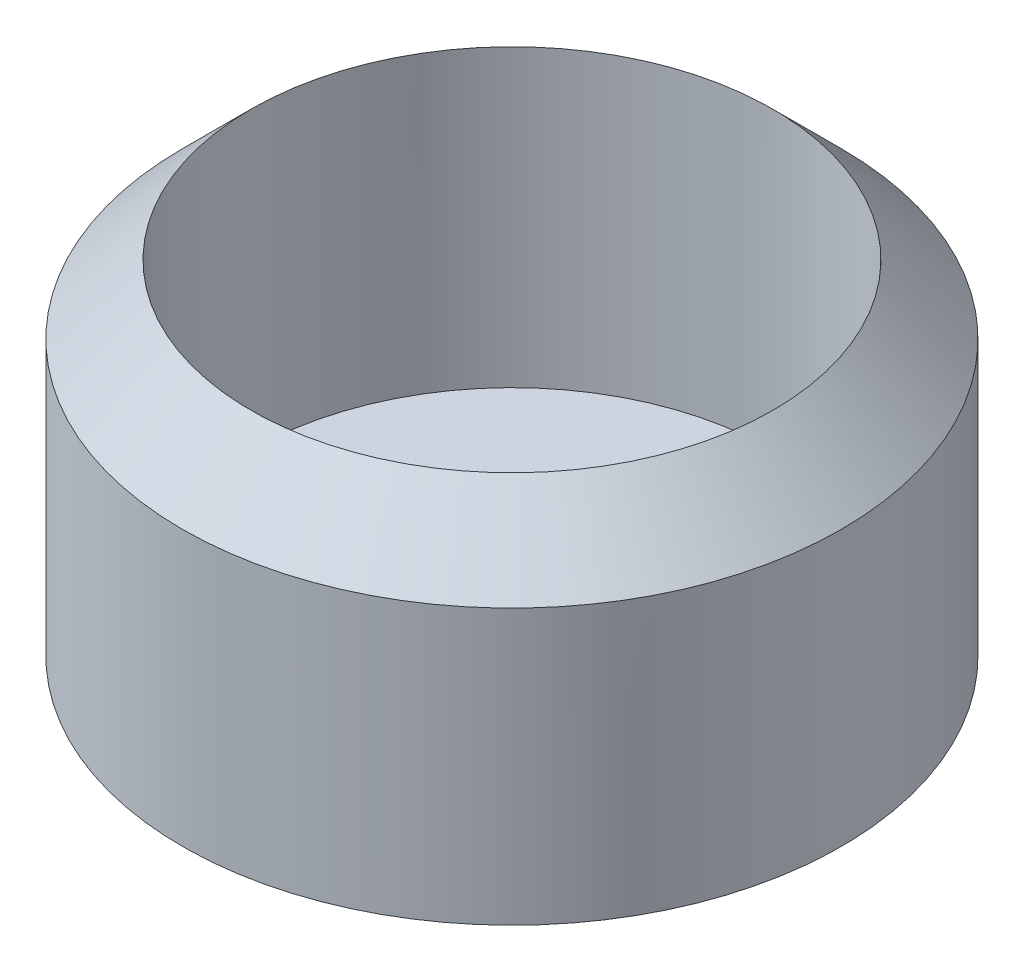
ISO-10303-21;
HEADER;
FILE_DESCRIPTION(('STEP AP214'),'2;1');
FILE_NAME('part.step','',(''),(''),'','','');
FILE_SCHEMA(('AUTOMOTIVE_DESIGN { 1 0 10303 214 1 1 1 1 }'));
ENDSEC;
DATA;
#1=APPLICATION_CONTEXT('core data for automotive mechanical design processes');
#2=APPLICATION_PROTOCOL_DEFINITION('international standard','automotive_design',2000,#1);
#3=PRODUCT_CONTEXT('',#1,'mechanical');
#4=PRODUCT('Part','Part','',(#3));
#5=PRODUCT_RELATED_PRODUCT_CATEGORY('part','',(#4));
#6=PRODUCT_DEFINITION_FORMATION('','',#4);
#7=PRODUCT_DEFINITION_CONTEXT('part definition',#1,'design');
#8=PRODUCT_DEFINITION('design','',#6,#7);
#9=PRODUCT_DEFINITION_SHAPE('','',#8);
#10=(LENGTH_UNIT() NAMED_UNIT(*) SI_UNIT(.MILLI.,.METRE.));
#11=(NAMED_UNIT(*) PLANE_ANGLE_UNIT() SI_UNIT($,.RADIAN.));
#12=(NAMED_UNIT(*) SI_UNIT($,.STERADIAN.) SOLID_ANGLE_UNIT());
#13=UNCERTAINTY_MEASURE_WITH_UNIT(LENGTH_MEASURE(1.E-05),#10,'distance_accuracy_value','');
#14=(GEOMETRIC_REPRESENTATION_CONTEXT(3) GLOBAL_UNCERTAINTY_ASSIGNED_CONTEXT((#13)) GLOBAL_UNIT_ASSIGNED_CONTEXT((#10,
#11,#12)) REPRESENTATION_CONTEXT('',''));
#15=CARTESIAN_POINT('',(0.,0.,0.));
#16=DIRECTION('',(0.,0.,1.));
#17=DIRECTION('',(1.,0.,0.));
#18=AXIS2_PLACEMENT_3D('',#15,#16,#17);
#19=CARTESIAN_POINT('',(0.,0.,0.));
#20=DIRECTION('',(0.,1.,0.));
#21=DIRECTION('',(-1.,0.,0.));
#22=AXIS2_PLACEMENT_3D('',#19,#20,#21);
#23=PLANE('',#22);
#24=CARTESIAN_POINT('',(0.,0.,0.));
#25=DIRECTION('',(0.,1.,0.));
#26=DIRECTION('',(-1.,0.,0.));
#27=AXIS2_PLACEMENT_3D('',#24,#25,#26);
#28=CIRCLE('',#27,22.5);
#29=CARTESIAN_POINT('',(-22.5,0.,0.));
#30=VERTEX_POINT('',#29);
#31=EDGE_CURVE('E67',#30,#30,#28,.T.);
#32=ORIENTED_EDGE('',*,*,#31,.T.);
#33=EDGE_LOOP('',(#32));
#34=FACE_BOUND('',#33,.T.);
#35=CARTESIAN_POINT('',(0.,0.,0.));
#36=DIRECTION('',(0.,1.,0.));
#37=DIRECTION('',(-1.,0.,0.));
#38=AXIS2_PLACEMENT_3D('',#35,#36,#37);
#39=CIRCLE('',#38,48.);
#40=CARTESIAN_POINT('',(-48.,0.,0.));
#41=VERTEX_POINT('',#40);
#42=EDGE_CURVE('E50',#41,#41,#39,.T.);
#43=ORIENTED_EDGE('',*,*,#42,.F.);
#44=EDGE_LOOP('',(#43));
#45=FACE_BOUND('',#44,.T.);
#46=ADVANCED_FACE('F41',(#34,#45),#23,.F.);
#47=CARTESIAN_POINT('',(0.,7.,0.));
#48=DIRECTION('',(0.,1.,0.));
#49=DIRECTION('',(-1.,0.,0.));
#50=AXIS2_PLACEMENT_3D('',#47,#48,#49);
#51=CYLINDRICAL_SURFACE('',#50,48.);
#52=CARTESIAN_POINT('',(0.,40.,0.));
#53=DIRECTION('',(0.,-1.,0.));
#54=DIRECTION('',(1.,0.,0.));
#55=AXIS2_PLACEMENT_3D('',#52,#53,#54);
#56=CIRCLE('',#55,48.);
#57=CARTESIAN_POINT('',(48.,40.,0.));
#58=VERTEX_POINT('',#57);
#59=EDGE_CURVE('E10',#58,#58,#56,.T.);
#60=ORIENTED_EDGE('',*,*,#59,.T.);
#61=EDGE_LOOP('',(#60));
#62=FACE_BOUND('',#61,.T.);
#63=ORIENTED_EDGE('',*,*,#42,.T.);
#64=EDGE_LOOP('',(#63));
#65=FACE_BOUND('',#64,.T.);
#66=ADVANCED_FACE('F84',(#62,#65),#51,.T.);
#67=CARTESIAN_POINT('',(0.,7.,0.));
#68=DIRECTION('',(0.,1.,0.));
#69=DIRECTION('',(-1.,0.,0.));
#70=AXIS2_PLACEMENT_3D('',#67,#68,#69);
#71=CYLINDRICAL_SURFACE('',#70,38.);
#72=CARTESIAN_POINT('',(0.,7.00000000000002,0.));
#73=DIRECTION('',(0.,1.,0.));
#74=DIRECTION('',(-1.,0.,0.));
#75=AXIS2_PLACEMENT_3D('',#72,#73,#74);
#76=CIRCLE('',#75,38.);
#77=CARTESIAN_POINT('',(-38.,7.00000000000002,0.));
#78=VERTEX_POINT('',#77);
#79=EDGE_CURVE('E61',#78,#78,#76,.T.);
#80=ORIENTED_EDGE('',*,*,#79,.F.);
#81=EDGE_LOOP('',(#80));
#82=FACE_BOUND('',#81,.T.);
#83=CARTESIAN_POINT('',(0.,50.,0.));
#84=DIRECTION('',(0.,1.,0.));
#85=DIRECTION('',(-1.,0.,0.));
#86=AXIS2_PLACEMENT_3D('',#83,#84,#85);
#87=CIRCLE('',#86,38.);
#88=CARTESIAN_POINT('',(38.,50.,0.));
#89=VERTEX_POINT('',#88);
#90=EDGE_CURVE('E55',#89,#89,#87,.T.);
#91=ORIENTED_EDGE('',*,*,#90,.T.);
#92=EDGE_LOOP('',(#91));
#93=FACE_BOUND('',#92,.T.);
#94=ADVANCED_FACE('F81',(#82,#93),#71,.F.);
#95=CARTESIAN_POINT('',(38.,7.,0.));
#96=DIRECTION('',(0.,-1.,0.));
#97=DIRECTION('',(1.,0.,0.));
#98=AXIS2_PLACEMENT_3D('',#95,#96,#97);
#99=PLANE('',#98);
#100=CARTESIAN_POINT('',(0.,7.00000000000001,0.));
#101=DIRECTION('',(0.,-1.,0.));
#102=DIRECTION('',(1.,0.,0.));
#103=AXIS2_PLACEMENT_3D('',#100,#101,#102);
#104=CIRCLE('',#103,22.5);
#105=CARTESIAN_POINT('',(22.5,7.,0.));
#106=VERTEX_POINT('',#105);
#107=EDGE_CURVE('E64',#106,#106,#104,.T.);
#108=ORIENTED_EDGE('',*,*,#107,.T.);
#109=EDGE_LOOP('',(#108));
#110=FACE_BOUND('',#109,.T.);
#111=ORIENTED_EDGE('',*,*,#79,.T.);
#112=EDGE_LOOP('',(#111));
#113=FACE_BOUND('',#112,.T.);
#114=ADVANCED_FACE('F79',(#110,#113),#99,.F.);
#115=CARTESIAN_POINT('',(0.,50.,0.));
#116=DIRECTION('',(0.,-1.,0.));
#117=DIRECTION('',(1.,0.,0.));
#118=AXIS2_PLACEMENT_3D('',#115,#116,#117);
#119=CYLINDRICAL_SURFACE('',#118,22.5);
#120=ORIENTED_EDGE('',*,*,#107,.F.);
#121=EDGE_LOOP('',(#120));
#122=FACE_BOUND('',#121,.T.);
#123=ORIENTED_EDGE('',*,*,#31,.F.);
#124=EDGE_LOOP('',(#123));
#125=FACE_BOUND('',#124,.T.);
#126=ADVANCED_FACE('F89',(#122,#125),#119,.F.);
#127=CARTESIAN_POINT('',(0.,50.,0.));
#128=DIRECTION('',(0.,-1.,0.));
#129=DIRECTION('',(1.,0.,0.));
#130=AXIS2_PLACEMENT_3D('',#127,#128,#129);
#131=CONICAL_SURFACE('',#130,38.,0.785398163397447);
#132=CARTESIAN_POINT('',(48.,40.,0.));
#133=CARTESIAN_POINT('',(47.8958333333333,40.1041666666666,0.));
#134=CARTESIAN_POINT('',(47.7916666666667,40.2083333333333,0.));
#135=CARTESIAN_POINT('',(47.5833333333333,40.4166666666666,0.));
#136=CARTESIAN_POINT('',(47.4791666666667,40.5208333333333,0.));
#137=CARTESIAN_POINT('',(47.2708333333333,40.7291666666666,0.));
#138=CARTESIAN_POINT('',(47.1666666666667,40.8333333333333,0.));
#139=CARTESIAN_POINT('',(46.9583333333333,41.0416666666666,0.));
#140=CARTESIAN_POINT('',(46.8541666666667,41.1458333333333,0.));
#141=CARTESIAN_POINT('',(46.6458333333333,41.3541666666666,0.));
#142=CARTESIAN_POINT('',(46.5416666666667,41.4583333333333,0.));
#143=CARTESIAN_POINT('',(46.3333333333333,41.6666666666666,0.));
#144=CARTESIAN_POINT('',(46.2291666666667,41.7708333333333,0.));
#145=CARTESIAN_POINT('',(46.0208333333333,41.9791666666666,0.));
#146=CARTESIAN_POINT('',(45.9166666666667,42.0833333333333,0.));
#147=CARTESIAN_POINT('',(45.7083333333333,42.2916666666666,0.));
#148=CARTESIAN_POINT('',(45.6041666666667,42.3958333333333,0.));
#149=CARTESIAN_POINT('',(45.3958333333333,42.6041666666666,0.));
#150=CARTESIAN_POINT('',(45.2916666666667,42.7083333333333,0.));
#151=CARTESIAN_POINT('',(45.0833333333333,42.9166666666666,0.));
#152=CARTESIAN_POINT('',(44.9791666666667,43.0208333333333,0.));
#153=CARTESIAN_POINT('',(44.7708333333333,43.2291666666666,0.));
#154=CARTESIAN_POINT('',(44.6666666666667,43.3333333333333,0.));
#155=CARTESIAN_POINT('',(44.4583333333333,43.5416666666666,0.));
#156=CARTESIAN_POINT('',(44.3541666666667,43.6458333333333,0.));
#157=CARTESIAN_POINT('',(44.1458333333333,43.8541666666666,0.));
#158=CARTESIAN_POINT('',(44.0416666666667,43.9583333333333,0.));
#159=CARTESIAN_POINT('',(43.8333333333333,44.1666666666666,0.));
#160=CARTESIAN_POINT('',(43.7291666666667,44.2708333333333,0.));
#161=CARTESIAN_POINT('',(43.5208333333333,44.4791666666667,0.));
#162=CARTESIAN_POINT('',(43.4166666666667,44.5833333333333,0.));
#163=CARTESIAN_POINT('',(43.2083333333333,44.7916666666667,0.));
#164=CARTESIAN_POINT('',(43.1041666666667,44.8958333333333,0.));
#165=CARTESIAN_POINT('',(42.8958333333333,45.1041666666667,0.));
#166=CARTESIAN_POINT('',(42.7916666666667,45.2083333333333,0.));
#167=CARTESIAN_POINT('',(42.5833333333333,45.4166666666667,0.));
#168=CARTESIAN_POINT('',(42.4791666666667,45.5208333333333,0.));
#169=CARTESIAN_POINT('',(42.2708333333333,45.7291666666667,0.));
#170=CARTESIAN_POINT('',(42.1666666666667,45.8333333333333,0.));
#171=CARTESIAN_POINT('',(41.9583333333333,46.0416666666667,0.));
#172=CARTESIAN_POINT('',(41.8541666666667,46.1458333333333,0.));
#173=CARTESIAN_POINT('',(41.6458333333333,46.3541666666667,0.));
#174=CARTESIAN_POINT('',(41.5416666666667,46.4583333333333,0.));
#175=CARTESIAN_POINT('',(41.3333333333333,46.6666666666667,0.));
#176=CARTESIAN_POINT('',(41.2291666666667,46.7708333333333,0.));
#177=CARTESIAN_POINT('',(41.0208333333333,46.9791666666667,0.));
#178=CARTESIAN_POINT('',(40.9166666666667,47.0833333333333,0.));
#179=CARTESIAN_POINT('',(40.7083333333333,47.2916666666667,0.));
#180=CARTESIAN_POINT('',(40.6041666666667,47.3958333333333,0.));
#181=CARTESIAN_POINT('',(40.3958333333333,47.6041666666667,0.));
#182=CARTESIAN_POINT('',(40.2916666666667,47.7083333333333,0.));
#183=CARTESIAN_POINT('',(40.0833333333333,47.9166666666667,0.));
#184=CARTESIAN_POINT('',(39.9791666666667,48.0208333333333,0.));
#185=CARTESIAN_POINT('',(39.7708333333333,48.2291666666667,0.));
#186=CARTESIAN_POINT('',(39.6666666666667,48.3333333333333,0.));
#187=CARTESIAN_POINT('',(39.4583333333333,48.5416666666667,0.));
#188=CARTESIAN_POINT('',(39.3541666666667,48.6458333333333,0.));
#189=CARTESIAN_POINT('',(39.1458333333333,48.8541666666667,0.));
#190=CARTESIAN_POINT('',(39.0416666666667,48.9583333333333,0.));
#191=CARTESIAN_POINT('',(38.8333333333333,49.1666666666667,0.));
#192=CARTESIAN_POINT('',(38.7291666666667,49.2708333333333,0.));
#193=CARTESIAN_POINT('',(38.5208333333333,49.4791666666667,0.));
#194=CARTESIAN_POINT('',(38.4166666666667,49.5833333333333,0.));
#195=CARTESIAN_POINT('',(38.2083333333333,49.7916666666667,0.));
#196=CARTESIAN_POINT('',(38.1041666666667,49.8958333333333,0.));
#197=CARTESIAN_POINT('',(38.,50.,0.));
#198=B_SPLINE_CURVE_WITH_KNOTS('',3,(#132,#133,#134,#135,#136,#137,#138,#139,#140,#141,#142,
#143,#144,#145,#146,#147,#148,#149,#150,#151,#152,#153,#154,#155,#156,#157,#158,#159,#160,#161,
#162,#163,#164,#165,#166,#167,#168,#169,#170,#171,#172,#173,#174,#175,#176,#177,#178,#179,#180,
#181,#182,#183,#184,#185,#186,#187,#188,#189,#190,#191,#192,#193,#194,#195,#196,#197),
.UNSPECIFIED.,.F.,.F.,(4,2,2,2,2,2,2,2,2,2,2,2,2,2,2,2,2,2,2,2,2,2,2,2,2,2,2,2,2,2,2,2,4),(0.,
0.441941738241588,0.883883476483185,1.32582521472478,1.76776695296638,2.20970869120797,
2.65165042944956,3.09359216769115,3.53553390593274,3.97747564417435,4.41941738241594,
4.86135912065753,5.30330085889913,5.74524259714072,6.18718433538232,6.62912607362391,
7.0710678118655,7.5130095501071,7.95495128834869,8.39689302659029,8.83883476483188,
9.28077650307347,9.72271824131506,10.1646599795567,10.6066017177983,11.0485434560399,
11.4904851942814,11.932426932523,12.3743686707646,12.8163104090062,13.2582521472478,
13.7001938854894,14.142135623731),.UNSPECIFIED.);
#199=EDGE_CURVE('BSEAM44',#58,#89,#198,.T.);
#200=ORIENTED_EDGE('',*,*,#59,.F.);
#201=ORIENTED_EDGE('',*,*,#90,.F.);
#202=ORIENTED_EDGE('',*,*,#199,.T.);
#203=ORIENTED_EDGE('',*,*,#199,.F.);
#204=EDGE_LOOP('',(#200,#202,#201,#203));
#205=FACE_BOUND('',#204,.T.);
#206=ADVANCED_FACE('F44',(#205),#131,.T.);
#207=CLOSED_SHELL('',(#46,#66,#94,#114,#126,#206));
#208=MANIFOLD_SOLID_BREP('B2',#207);
#209=ADVANCED_BREP_SHAPE_REPRESENTATION('',(#18,#208),#14);
#210=SHAPE_DEFINITION_REPRESENTATION(#9,#209);
ENDSEC;
END-ISO-10303-21;
